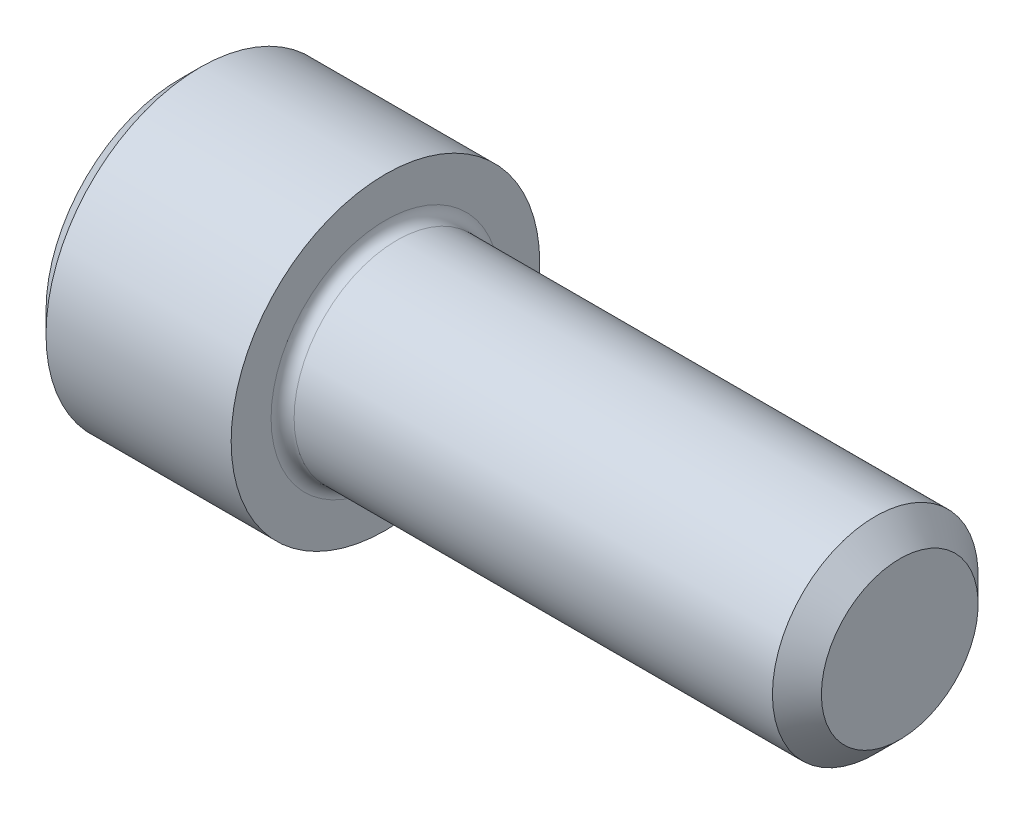
ISO-10303-21;
HEADER;
FILE_DESCRIPTION(('STEP AP214'),'2;1');
FILE_NAME('part.step','',(''),(''),'','','');
FILE_SCHEMA(('AUTOMOTIVE_DESIGN { 1 0 10303 214 1 1 1 1 }'));
ENDSEC;
DATA;
#1=APPLICATION_CONTEXT('core data for automotive mechanical design processes');
#2=APPLICATION_PROTOCOL_DEFINITION('international standard','automotive_design',2000,#1);
#3=PRODUCT_CONTEXT('',#1,'mechanical');
#4=PRODUCT('Part','Part','',(#3));
#5=PRODUCT_RELATED_PRODUCT_CATEGORY('part','',(#4));
#6=PRODUCT_DEFINITION_FORMATION('','',#4);
#7=PRODUCT_DEFINITION_CONTEXT('part definition',#1,'design');
#8=PRODUCT_DEFINITION('design','',#6,#7);
#9=PRODUCT_DEFINITION_SHAPE('','',#8);
#10=(LENGTH_UNIT() NAMED_UNIT(*) SI_UNIT(.MILLI.,.METRE.));
#11=(NAMED_UNIT(*) PLANE_ANGLE_UNIT() SI_UNIT($,.RADIAN.));
#12=(NAMED_UNIT(*) SI_UNIT($,.STERADIAN.) SOLID_ANGLE_UNIT());
#13=UNCERTAINTY_MEASURE_WITH_UNIT(LENGTH_MEASURE(1.E-05),#10,'distance_accuracy_value','');
#14=(GEOMETRIC_REPRESENTATION_CONTEXT(3) GLOBAL_UNCERTAINTY_ASSIGNED_CONTEXT((#13)) GLOBAL_UNIT_ASSIGNED_CONTEXT((#10,
#11,#12)) REPRESENTATION_CONTEXT('',''));
#15=CARTESIAN_POINT('',(0.,0.,0.));
#16=DIRECTION('',(0.,0.,1.));
#17=DIRECTION('',(1.,0.,0.));
#18=AXIS2_PLACEMENT_3D('',#15,#16,#17);
#19=CARTESIAN_POINT('',(0.,0.,0.));
#20=DIRECTION('',(-1.,0.,0.));
#21=DIRECTION('',(0.,0.,1.));
#22=AXIS2_PLACEMENT_3D('',#19,#20,#21);
#23=PLANE('',#22);
#24=DIRECTION('',(0.,-0.5,0.866025403784439));
#25=VECTOR('',#24,1.);
#26=CARTESIAN_POINT('',(0.,2.74963065701561,0.));
#27=LINE('',#26,#25);
#28=CARTESIAN_POINT('',(0.,2.74963065701561,0.));
#29=VERTEX_POINT('',#28);
#30=CARTESIAN_POINT('',(0.,1.37481532850781,2.38125));
#31=VERTEX_POINT('',#30);
#32=EDGE_CURVE('E261',#29,#31,#27,.T.);
#33=ORIENTED_EDGE('',*,*,#32,.T.);
#34=DIRECTION('',(0.,1.,0.));
#35=VECTOR('',#34,1.);
#36=CARTESIAN_POINT('',(0.,-1.37481532850781,2.38125000000001));
#37=LINE('',#36,#35);
#38=CARTESIAN_POINT('',(0.,-1.37481532850781,2.38125000000001));
#39=VERTEX_POINT('',#38);
#40=EDGE_CURVE('E132',#39,#31,#37,.T.);
#41=ORIENTED_EDGE('',*,*,#40,.F.);
#42=DIRECTION('',(0.,-0.500000000000001,-0.866025403784438));
#43=VECTOR('',#42,1.);
#44=CARTESIAN_POINT('',(0.,-1.37481532850781,2.38125000000001));
#45=LINE('',#44,#43);
#46=CARTESIAN_POINT('',(0.,-2.74963065701561,0.));
#47=VERTEX_POINT('',#46);
#48=EDGE_CURVE('E264',#39,#47,#45,.T.);
#49=ORIENTED_EDGE('',*,*,#48,.T.);
#50=DIRECTION('',(0.,0.5,-0.866025403784439));
#51=VECTOR('',#50,1.);
#52=CARTESIAN_POINT('',(0.,-2.74963065701561,0.));
#53=LINE('',#52,#51);
#54=CARTESIAN_POINT('',(0.,-1.37481532850781,-2.38124999999999));
#55=VERTEX_POINT('',#54);
#56=EDGE_CURVE('E267',#47,#55,#53,.T.);
#57=ORIENTED_EDGE('',*,*,#56,.T.);
#58=DIRECTION('',(0.,-1.,0.));
#59=VECTOR('',#58,1.);
#60=CARTESIAN_POINT('',(0.,1.37481532850781,-2.38124999999999));
#61=LINE('',#60,#59);
#62=CARTESIAN_POINT('',(0.,1.37481532850781,-2.38124999999999));
#63=VERTEX_POINT('',#62);
#64=EDGE_CURVE('E270',#63,#55,#61,.T.);
#65=ORIENTED_EDGE('',*,*,#64,.F.);
#66=DIRECTION('',(0.,-0.500000000000001,-0.866025403784438));
#67=VECTOR('',#66,1.);
#68=CARTESIAN_POINT('',(0.,2.74963065701561,0.));
#69=LINE('',#68,#67);
#70=EDGE_CURVE('E127',#29,#63,#69,.T.);
#71=ORIENTED_EDGE('',*,*,#70,.F.);
#72=EDGE_LOOP('',(#33,#41,#49,#57,#65,#71));
#73=FACE_BOUND('',#72,.T.);
#74=CARTESIAN_POINT('',(0.,0.,0.));
#75=DIRECTION('',(-1.,0.,0.));
#76=DIRECTION('',(0.,0.,1.));
#77=AXIS2_PLACEMENT_3D('',#74,#75,#76);
#78=CIRCLE('',#77,4.1275);
#79=CARTESIAN_POINT('',(0.,0.,4.1275));
#80=VERTEX_POINT('',#79);
#81=EDGE_CURVE('E156',#80,#80,#78,.T.);
#82=ORIENTED_EDGE('',*,*,#81,.T.);
#83=EDGE_LOOP('',(#82));
#84=FACE_BOUND('',#83,.T.);
#85=ADVANCED_FACE('F36',(#73,#84),#23,.T.);
#86=CARTESIAN_POINT('',(0.,0.,0.));
#87=DIRECTION('',(1.,0.,0.));
#88=DIRECTION('',(0.,0.,-1.));
#89=AXIS2_PLACEMENT_3D('',#86,#87,#88);
#90=CONICAL_SURFACE('',#89,4.1275,0.785398163397447);
#91=CARTESIAN_POINT('',(0.635000000000004,0.,0.));
#92=DIRECTION('',(-1.,0.,0.));
#93=DIRECTION('',(0.,0.,1.));
#94=AXIS2_PLACEMENT_3D('',#91,#92,#93);
#95=CIRCLE('',#94,4.7625);
#96=CARTESIAN_POINT('',(0.635000000000004,0.,4.7625));
#97=VERTEX_POINT('',#96);
#98=EDGE_CURVE('E153',#97,#97,#95,.T.);
#99=ORIENTED_EDGE('',*,*,#98,.T.);
#100=EDGE_LOOP('',(#99));
#101=FACE_BOUND('',#100,.T.);
#102=ORIENTED_EDGE('',*,*,#81,.F.);
#103=EDGE_LOOP('',(#102));
#104=FACE_BOUND('',#103,.T.);
#105=ADVANCED_FACE('F177',(#101,#104),#90,.T.);
#106=CARTESIAN_POINT('',(-31.75,0.,0.));
#107=DIRECTION('',(-1.,0.,0.));
#108=DIRECTION('',(0.,0.,1.));
#109=AXIS2_PLACEMENT_3D('',#106,#107,#108);
#110=CYLINDRICAL_SURFACE('',#109,4.7625);
#111=CARTESIAN_POINT('',(6.35,0.,0.));
#112=DIRECTION('',(-1.,0.,0.));
#113=DIRECTION('',(0.,0.,1.));
#114=AXIS2_PLACEMENT_3D('',#111,#112,#113);
#115=CIRCLE('',#114,4.7625);
#116=CARTESIAN_POINT('',(6.35,0.,4.7625));
#117=VERTEX_POINT('',#116);
#118=EDGE_CURVE('E150',#117,#117,#115,.T.);
#119=ORIENTED_EDGE('',*,*,#118,.T.);
#120=EDGE_LOOP('',(#119));
#121=FACE_BOUND('',#120,.T.);
#122=ORIENTED_EDGE('',*,*,#98,.F.);
#123=EDGE_LOOP('',(#122));
#124=FACE_BOUND('',#123,.T.);
#125=ADVANCED_FACE('F182',(#121,#124),#110,.T.);
#126=CARTESIAN_POINT('',(6.35,4.7625,0.));
#127=DIRECTION('',(1.,0.,0.));
#128=DIRECTION('',(0.,0.,-1.));
#129=AXIS2_PLACEMENT_3D('',#126,#127,#128);
#130=PLANE('',#129);
#131=CARTESIAN_POINT('',(6.35,0.,0.));
#132=DIRECTION('',(1.,0.,0.));
#133=DIRECTION('',(0.,0.,-1.));
#134=AXIS2_PLACEMENT_3D('',#131,#132,#133);
#135=CIRCLE('',#134,3.53059999999998);
#136=CARTESIAN_POINT('',(6.35,0.,-3.53059999999998));
#137=VERTEX_POINT('',#136);
#138=EDGE_CURVE('E44',#137,#137,#135,.F.);
#139=ORIENTED_EDGE('',*,*,#138,.T.);
#140=EDGE_LOOP('',(#139));
#141=FACE_BOUND('',#140,.T.);
#142=ORIENTED_EDGE('',*,*,#118,.F.);
#143=EDGE_LOOP('',(#142));
#144=FACE_BOUND('',#143,.T.);
#145=ADVANCED_FACE('F161',(#141,#144),#130,.T.);
#146=CARTESIAN_POINT('',(-31.75,0.,0.));
#147=DIRECTION('',(-1.,0.,0.));
#148=DIRECTION('',(0.,0.,1.));
#149=AXIS2_PLACEMENT_3D('',#146,#147,#148);
#150=CYLINDRICAL_SURFACE('',#149,3.17499999999998);
#151=CARTESIAN_POINT('',(6.7056,0.,0.));
#152=DIRECTION('',(1.,0.,0.));
#153=DIRECTION('',(0.,0.,-1.));
#154=AXIS2_PLACEMENT_3D('',#151,#152,#153);
#155=CIRCLE('',#154,3.17499999999998);
#156=CARTESIAN_POINT('',(6.7056,0.,-3.17499999999998));
#157=VERTEX_POINT('',#156);
#158=EDGE_CURVE('E11',#157,#157,#155,.T.);
#159=ORIENTED_EDGE('',*,*,#158,.T.);
#160=EDGE_LOOP('',(#159));
#161=FACE_BOUND('',#160,.T.);
#162=CARTESIAN_POINT('',(21.46935,0.,0.));
#163=DIRECTION('',(-1.,0.,0.));
#164=DIRECTION('',(0.,0.,1.));
#165=AXIS2_PLACEMENT_3D('',#162,#163,#164);
#166=CIRCLE('',#165,3.17499999999996);
#167=CARTESIAN_POINT('',(21.46935,0.,3.17499999999996));
#168=VERTEX_POINT('',#167);
#169=EDGE_CURVE('E147',#168,#168,#166,.T.);
#170=ORIENTED_EDGE('',*,*,#169,.T.);
#171=EDGE_LOOP('',(#170));
#172=FACE_BOUND('',#171,.T.);
#173=ADVANCED_FACE('F192',(#161,#172),#150,.T.);
#174=CARTESIAN_POINT('',(22.225,0.,0.));
#175=DIRECTION('',(-1.,0.,0.));
#176=DIRECTION('',(0.,0.,1.));
#177=AXIS2_PLACEMENT_3D('',#174,#175,#176);
#178=CONICAL_SURFACE('',#177,2.41935,0.785398163397408);
#179=ORIENTED_EDGE('',*,*,#169,.F.);
#180=EDGE_LOOP('',(#179));
#181=FACE_BOUND('',#180,.T.);
#182=CARTESIAN_POINT('',(22.225,0.,0.));
#183=DIRECTION('',(-1.,0.,0.));
#184=DIRECTION('',(0.,0.,1.));
#185=AXIS2_PLACEMENT_3D('',#182,#183,#184);
#186=CIRCLE('',#185,2.41935);
#187=CARTESIAN_POINT('',(22.225,0.,2.41935));
#188=VERTEX_POINT('',#187);
#189=EDGE_CURVE('E143',#188,#188,#186,.T.);
#190=ORIENTED_EDGE('',*,*,#189,.T.);
#191=EDGE_LOOP('',(#190));
#192=FACE_BOUND('',#191,.T.);
#193=ADVANCED_FACE('F172',(#181,#192),#178,.T.);
#194=CARTESIAN_POINT('',(22.225,2.41934999999999,0.));
#195=DIRECTION('',(1.,0.,0.));
#196=DIRECTION('',(0.,0.,-1.));
#197=AXIS2_PLACEMENT_3D('',#194,#195,#196);
#198=PLANE('',#197);
#199=ORIENTED_EDGE('',*,*,#189,.F.);
#200=EDGE_LOOP('',(#199));
#201=FACE_BOUND('',#200,.T.);
#202=ADVANCED_FACE('F165',(#201),#198,.T.);
#203=CARTESIAN_POINT('',(6.7056,0.,0.));
#204=DIRECTION('',(1.,0.,0.));
#205=DIRECTION('',(0.,0.,-1.));
#206=AXIS2_PLACEMENT_3D('',#203,#204,#205);
#207=TOROIDAL_SURFACE('',#206,3.53059999999998,0.3556);
#208=ORIENTED_EDGE('',*,*,#158,.F.);
#209=EDGE_LOOP('',(#208));
#210=FACE_BOUND('',#209,.T.);
#211=ORIENTED_EDGE('',*,*,#138,.F.);
#212=EDGE_LOOP('',(#211));
#213=FACE_BOUND('',#212,.T.);
#214=ADVANCED_FACE('F38',(#210,#213),#207,.F.);
#215=CARTESIAN_POINT('',(3.048,2.74963065701561,0.));
#216=DIRECTION('',(0.,-0.866025403784439,-0.5));
#217=DIRECTION('',(0.,0.5,-0.866025403784439));
#218=AXIS2_PLACEMENT_3D('',#215,#216,#217);
#219=PLANE('',#218);
#220=ORIENTED_EDGE('',*,*,#32,.F.);
#221=DIRECTION('',(-1.,0.,0.));
#222=VECTOR('',#221,1.);
#223=CARTESIAN_POINT('',(3.048,2.74963065701561,0.));
#224=LINE('',#223,#222);
#225=CARTESIAN_POINT('',(3.048,2.74963065701561,0.));
#226=VERTEX_POINT('',#225);
#227=EDGE_CURVE('E251',#226,#29,#224,.T.);
#228=ORIENTED_EDGE('',*,*,#227,.F.);
#229=DIRECTION('',(0.,-0.5,0.866025403784439));
#230=VECTOR('',#229,1.);
#231=CARTESIAN_POINT('',(3.048,2.74963065701561,0.));
#232=LINE('',#231,#230);
#233=CARTESIAN_POINT('',(3.048,2.06222299276171,1.190625));
#234=VERTEX_POINT('',#233);
#235=EDGE_CURVE('E119',#226,#234,#232,.T.);
#236=ORIENTED_EDGE('',*,*,#235,.T.);
#237=CARTESIAN_POINT('',(3.048,1.37481532850781,2.38125));
#238=VERTEX_POINT('',#237);
#239=EDGE_CURVE('E110',#234,#238,#232,.T.);
#240=ORIENTED_EDGE('',*,*,#239,.T.);
#241=DIRECTION('',(-1.,0.,0.));
#242=VECTOR('',#241,1.);
#243=CARTESIAN_POINT('',(3.048,1.37481532850781,2.38125));
#244=LINE('',#243,#242);
#245=EDGE_CURVE('E124',#238,#31,#244,.T.);
#246=ORIENTED_EDGE('',*,*,#245,.T.);
#247=EDGE_LOOP('',(#220,#228,#236,#240,#246));
#248=FACE_BOUND('',#247,.T.);
#249=ADVANCED_FACE('F123',(#248),#219,.T.);
#250=CARTESIAN_POINT('',(3.048,-1.37481532850781,2.38125000000001));
#251=DIRECTION('',(0.,0.,1.));
#252=DIRECTION('',(0.,-1.,0.));
#253=AXIS2_PLACEMENT_3D('',#250,#251,#252);
#254=PLANE('',#253);
#255=ORIENTED_EDGE('',*,*,#40,.T.);
#256=ORIENTED_EDGE('',*,*,#245,.F.);
#257=DIRECTION('',(0.,1.,0.));
#258=VECTOR('',#257,1.);
#259=CARTESIAN_POINT('',(3.048,-1.37481532850781,2.38125000000001));
#260=LINE('',#259,#258);
#261=CARTESIAN_POINT('',(3.048,0.,2.38125000000001));
#262=VERTEX_POINT('',#261);
#263=EDGE_CURVE('E107',#262,#238,#260,.T.);
#264=ORIENTED_EDGE('',*,*,#263,.F.);
#265=CARTESIAN_POINT('',(3.048,-1.37481532850781,2.38125000000001));
#266=VERTEX_POINT('',#265);
#267=EDGE_CURVE('E118',#266,#262,#260,.T.);
#268=ORIENTED_EDGE('',*,*,#267,.F.);
#269=DIRECTION('',(-1.,0.,0.));
#270=VECTOR('',#269,1.);
#271=CARTESIAN_POINT('',(3.048,-1.37481532850781,2.38125000000001));
#272=LINE('',#271,#270);
#273=EDGE_CURVE('E134',#266,#39,#272,.T.);
#274=ORIENTED_EDGE('',*,*,#273,.T.);
#275=EDGE_LOOP('',(#255,#256,#264,#268,#274));
#276=FACE_BOUND('',#275,.T.);
#277=ADVANCED_FACE('F129',(#276),#254,.F.);
#278=CARTESIAN_POINT('',(3.048,-1.37481532850781,2.38125000000001));
#279=DIRECTION('',(0.,0.866025403784438,-0.500000000000001));
#280=DIRECTION('',(0.,0.500000000000001,0.866025403784438));
#281=AXIS2_PLACEMENT_3D('',#278,#279,#280);
#282=PLANE('',#281);
#283=ORIENTED_EDGE('',*,*,#48,.F.);
#284=ORIENTED_EDGE('',*,*,#273,.F.);
#285=DIRECTION('',(0.,-0.500000000000001,-0.866025403784438));
#286=VECTOR('',#285,1.);
#287=CARTESIAN_POINT('',(3.048,-1.37481532850781,2.38125000000001));
#288=LINE('',#287,#286);
#289=CARTESIAN_POINT('',(3.048,-2.06222299276171,1.190625));
#290=VERTEX_POINT('',#289);
#291=EDGE_CURVE('E290',#266,#290,#288,.T.);
#292=ORIENTED_EDGE('',*,*,#291,.T.);
#293=CARTESIAN_POINT('',(3.048,-2.74963065701561,0.));
#294=VERTEX_POINT('',#293);
#295=EDGE_CURVE('E279',#290,#294,#288,.T.);
#296=ORIENTED_EDGE('',*,*,#295,.T.);
#297=DIRECTION('',(-1.,0.,0.));
#298=VECTOR('',#297,1.);
#299=CARTESIAN_POINT('',(3.048,-2.74963065701561,0.));
#300=LINE('',#299,#298);
#301=EDGE_CURVE('E139',#294,#47,#300,.T.);
#302=ORIENTED_EDGE('',*,*,#301,.T.);
#303=EDGE_LOOP('',(#283,#284,#292,#296,#302));
#304=FACE_BOUND('',#303,.T.);
#305=ADVANCED_FACE('F205',(#304),#282,.T.);
#306=CARTESIAN_POINT('',(3.048,-2.74963065701561,0.));
#307=DIRECTION('',(0.,0.866025403784439,0.5));
#308=DIRECTION('',(0.,-0.5,0.866025403784439));
#309=AXIS2_PLACEMENT_3D('',#306,#307,#308);
#310=PLANE('',#309);
#311=ORIENTED_EDGE('',*,*,#56,.F.);
#312=ORIENTED_EDGE('',*,*,#301,.F.);
#313=DIRECTION('',(0.,0.5,-0.866025403784439));
#314=VECTOR('',#313,1.);
#315=CARTESIAN_POINT('',(3.048,-2.74963065701561,0.));
#316=LINE('',#315,#314);
#317=CARTESIAN_POINT('',(3.048,-2.06222299276171,-1.19062499999999));
#318=VERTEX_POINT('',#317);
#319=EDGE_CURVE('E257',#294,#318,#316,.T.);
#320=ORIENTED_EDGE('',*,*,#319,.T.);
#321=CARTESIAN_POINT('',(3.048,-1.37481532850781,-2.38124999999999));
#322=VERTEX_POINT('',#321);
#323=EDGE_CURVE('E289',#318,#322,#316,.T.);
#324=ORIENTED_EDGE('',*,*,#323,.T.);
#325=DIRECTION('',(-1.,0.,0.));
#326=VECTOR('',#325,1.);
#327=CARTESIAN_POINT('',(3.048,-1.37481532850781,-2.38124999999999));
#328=LINE('',#327,#326);
#329=EDGE_CURVE('E250',#322,#55,#328,.T.);
#330=ORIENTED_EDGE('',*,*,#329,.T.);
#331=EDGE_LOOP('',(#311,#312,#320,#324,#330));
#332=FACE_BOUND('',#331,.T.);
#333=ADVANCED_FACE('F208',(#332),#310,.T.);
#334=CARTESIAN_POINT('',(3.048,1.37481532850781,-2.38124999999999));
#335=DIRECTION('',(0.,0.,-1.));
#336=DIRECTION('',(0.,1.,0.));
#337=AXIS2_PLACEMENT_3D('',#334,#335,#336);
#338=PLANE('',#337);
#339=ORIENTED_EDGE('',*,*,#64,.T.);
#340=ORIENTED_EDGE('',*,*,#329,.F.);
#341=DIRECTION('',(0.,-1.,0.));
#342=VECTOR('',#341,1.);
#343=CARTESIAN_POINT('',(3.048,1.37481532850781,-2.38124999999999));
#344=LINE('',#343,#342);
#345=CARTESIAN_POINT('',(3.048,0.,-2.38125));
#346=VERTEX_POINT('',#345);
#347=EDGE_CURVE('E254',#346,#322,#344,.T.);
#348=ORIENTED_EDGE('',*,*,#347,.F.);
#349=CARTESIAN_POINT('',(3.048,1.37481532850781,-2.38124999999999));
#350=VERTEX_POINT('',#349);
#351=EDGE_CURVE('E51',#350,#346,#344,.T.);
#352=ORIENTED_EDGE('',*,*,#351,.F.);
#353=DIRECTION('',(-1.,0.,0.));
#354=VECTOR('',#353,1.);
#355=CARTESIAN_POINT('',(3.048,1.37481532850781,-2.38124999999999));
#356=LINE('',#355,#354);
#357=EDGE_CURVE('E247',#350,#63,#356,.T.);
#358=ORIENTED_EDGE('',*,*,#357,.T.);
#359=EDGE_LOOP('',(#339,#340,#348,#352,#358));
#360=FACE_BOUND('',#359,.T.);
#361=ADVANCED_FACE('F212',(#360),#338,.F.);
#362=CARTESIAN_POINT('',(3.048,2.74963065701561,0.));
#363=DIRECTION('',(0.,0.866025403784438,-0.500000000000001));
#364=DIRECTION('',(0.,0.500000000000001,0.866025403784438));
#365=AXIS2_PLACEMENT_3D('',#362,#363,#364);
#366=PLANE('',#365);
#367=ORIENTED_EDGE('',*,*,#70,.T.);
#368=ORIENTED_EDGE('',*,*,#357,.F.);
#369=DIRECTION('',(0.,-0.500000000000001,-0.866025403784438));
#370=VECTOR('',#369,1.);
#371=CARTESIAN_POINT('',(3.048,2.74963065701561,0.));
#372=LINE('',#371,#370);
#373=CARTESIAN_POINT('',(3.048,2.06222299276171,-1.190625));
#374=VERTEX_POINT('',#373);
#375=EDGE_CURVE('E237',#374,#350,#372,.T.);
#376=ORIENTED_EDGE('',*,*,#375,.F.);
#377=EDGE_CURVE('E243',#226,#374,#372,.T.);
#378=ORIENTED_EDGE('',*,*,#377,.F.);
#379=ORIENTED_EDGE('',*,*,#227,.T.);
#380=EDGE_LOOP('',(#367,#368,#376,#378,#379));
#381=FACE_BOUND('',#380,.T.);
#382=ADVANCED_FACE('F216',(#381),#366,.F.);
#383=CARTESIAN_POINT('',(3.048,2.74963065701561,0.));
#384=DIRECTION('',(1.,0.,0.));
#385=DIRECTION('',(0.,0.,-1.));
#386=AXIS2_PLACEMENT_3D('',#383,#384,#385);
#387=PLANE('',#386);
#388=ORIENTED_EDGE('',*,*,#347,.T.);
#389=ORIENTED_EDGE('',*,*,#323,.F.);
#390=CARTESIAN_POINT('',(3.048,0.,0.));
#391=DIRECTION('',(-1.,0.,0.));
#392=DIRECTION('',(0.,0.,1.));
#393=AXIS2_PLACEMENT_3D('',#390,#391,#392);
#394=CIRCLE('',#393,2.38125);
#395=EDGE_CURVE('E285',#346,#318,#394,.T.);
#396=ORIENTED_EDGE('',*,*,#395,.F.);
#397=EDGE_LOOP('',(#388,#389,#396));
#398=FACE_BOUND('',#397,.T.);
#399=ADVANCED_FACE('F220',(#398),#387,.F.);
#400=ORIENTED_EDGE('',*,*,#319,.F.);
#401=ORIENTED_EDGE('',*,*,#295,.F.);
#402=EDGE_CURVE('E137',#318,#290,#394,.T.);
#403=ORIENTED_EDGE('',*,*,#402,.F.);
#404=EDGE_LOOP('',(#400,#401,#403));
#405=FACE_BOUND('',#404,.T.);
#406=ADVANCED_FACE('F223',(#405),#387,.F.);
#407=ORIENTED_EDGE('',*,*,#291,.F.);
#408=ORIENTED_EDGE('',*,*,#267,.T.);
#409=EDGE_CURVE('E133',#290,#262,#394,.T.);
#410=ORIENTED_EDGE('',*,*,#409,.F.);
#411=EDGE_LOOP('',(#407,#408,#410));
#412=FACE_BOUND('',#411,.T.);
#413=ADVANCED_FACE('F228',(#412),#387,.F.);
#414=ORIENTED_EDGE('',*,*,#263,.T.);
#415=ORIENTED_EDGE('',*,*,#239,.F.);
#416=EDGE_CURVE('E113',#262,#234,#394,.T.);
#417=ORIENTED_EDGE('',*,*,#416,.F.);
#418=EDGE_LOOP('',(#414,#415,#417));
#419=FACE_BOUND('',#418,.T.);
#420=ADVANCED_FACE('F109',(#419),#387,.F.);
#421=ORIENTED_EDGE('',*,*,#235,.F.);
#422=ORIENTED_EDGE('',*,*,#377,.T.);
#423=EDGE_CURVE('E144',#234,#374,#394,.T.);
#424=ORIENTED_EDGE('',*,*,#423,.F.);
#425=EDGE_LOOP('',(#421,#422,#424));
#426=FACE_BOUND('',#425,.T.);
#427=ADVANCED_FACE('F231',(#426),#387,.F.);
#428=ORIENTED_EDGE('',*,*,#375,.T.);
#429=ORIENTED_EDGE('',*,*,#351,.T.);
#430=EDGE_CURVE('E240',#374,#346,#394,.T.);
#431=ORIENTED_EDGE('',*,*,#430,.F.);
#432=EDGE_LOOP('',(#428,#429,#431));
#433=FACE_BOUND('',#432,.T.);
#434=ADVANCED_FACE('F201',(#433),#387,.F.);
#435=CARTESIAN_POINT('',(3.048,0.,0.));
#436=DIRECTION('',(-1.,0.,0.));
#437=DIRECTION('',(0.,0.,1.));
#438=AXIS2_PLACEMENT_3D('',#435,#436,#437);
#439=CONICAL_SURFACE('',#438,2.38125,1.04719755119659);
#440=CARTESIAN_POINT('',(4.42281532850781,0.,0.));
#441=VERTEX_POINT('',#440);
#442=VERTEX_LOOP('',#441);
#443=FACE_BOUND('',#442,.T.);
#444=ORIENTED_EDGE('',*,*,#416,.T.);
#445=ORIENTED_EDGE('',*,*,#423,.T.);
#446=ORIENTED_EDGE('',*,*,#430,.T.);
#447=ORIENTED_EDGE('',*,*,#395,.T.);
#448=ORIENTED_EDGE('',*,*,#402,.T.);
#449=ORIENTED_EDGE('',*,*,#409,.T.);
#450=EDGE_LOOP('',(#444,#445,#446,#447,#448,#449));
#451=FACE_BOUND('',#450,.T.);
#452=ADVANCED_FACE('F199',(#443,#451),#439,.F.);
#453=CLOSED_SHELL('',(#85,#105,#125,#145,#173,#193,#202,#214,#249,#277,#305,#333,#361,#382,#399,
#406,#413,#420,#427,#434,#452));
#454=MANIFOLD_SOLID_BREP('B2',#453);
#455=ADVANCED_BREP_SHAPE_REPRESENTATION('',(#18,#454),#14);
#456=SHAPE_DEFINITION_REPRESENTATION(#9,#455);
ENDSEC;
END-ISO-10303-21;
